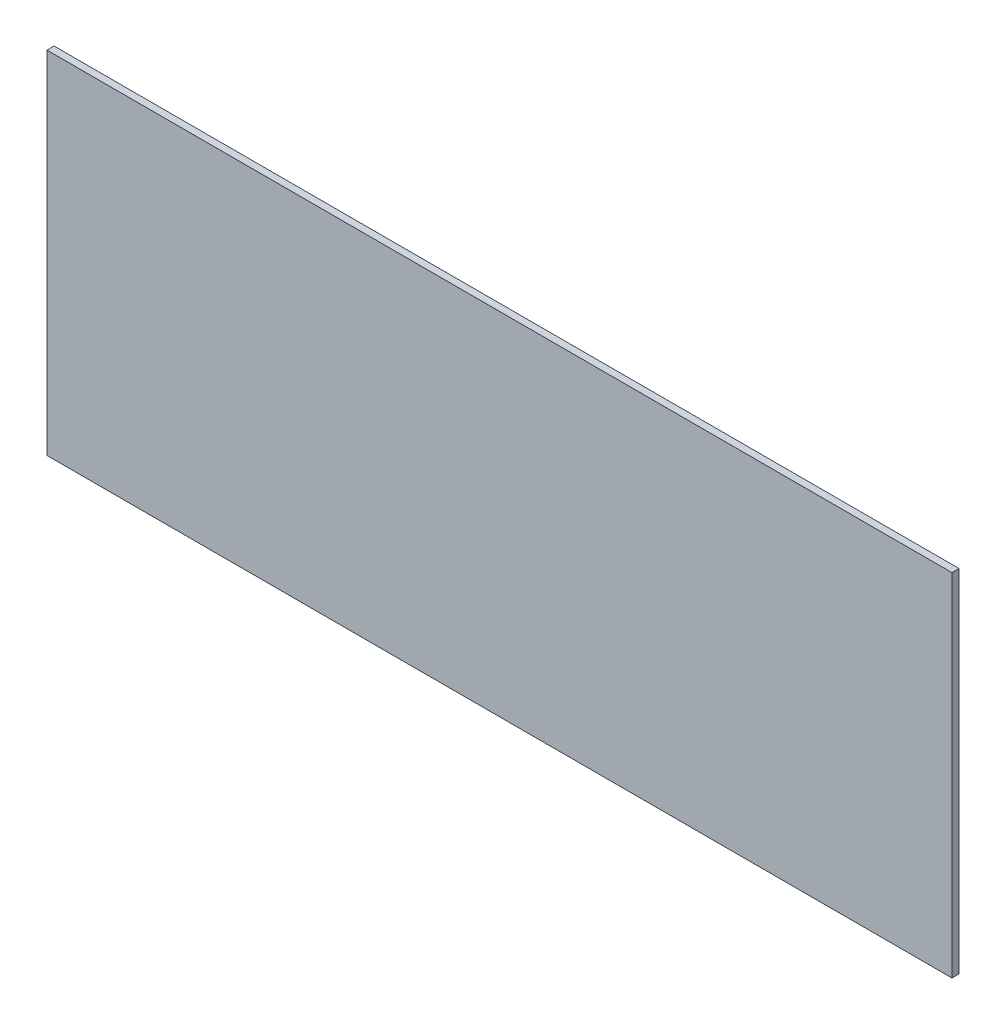
ISO-10303-21;
HEADER;
FILE_DESCRIPTION(('STEP AP214'),'2;1');
FILE_NAME('part.step','',(''),(''),'','','');
FILE_SCHEMA(('AUTOMOTIVE_DESIGN { 1 0 10303 214 1 1 1 1 }'));
ENDSEC;
DATA;
#1=APPLICATION_CONTEXT('core data for automotive mechanical design processes');
#2=APPLICATION_PROTOCOL_DEFINITION('international standard','automotive_design',2000,#1);
#3=PRODUCT_CONTEXT('',#1,'mechanical');
#4=PRODUCT('Part','Part','',(#3));
#5=PRODUCT_RELATED_PRODUCT_CATEGORY('part','',(#4));
#6=PRODUCT_DEFINITION_FORMATION('','',#4);
#7=PRODUCT_DEFINITION_CONTEXT('part definition',#1,'design');
#8=PRODUCT_DEFINITION('design','',#6,#7);
#9=PRODUCT_DEFINITION_SHAPE('','',#8);
#10=(LENGTH_UNIT() NAMED_UNIT(*) SI_UNIT(.MILLI.,.METRE.));
#11=(NAMED_UNIT(*) PLANE_ANGLE_UNIT() SI_UNIT($,.RADIAN.));
#12=(NAMED_UNIT(*) SI_UNIT($,.STERADIAN.) SOLID_ANGLE_UNIT());
#13=UNCERTAINTY_MEASURE_WITH_UNIT(LENGTH_MEASURE(1.E-05),#10,'distance_accuracy_value','');
#14=(GEOMETRIC_REPRESENTATION_CONTEXT(3) GLOBAL_UNCERTAINTY_ASSIGNED_CONTEXT((#13)) GLOBAL_UNIT_ASSIGNED_CONTEXT((#10,
#11,#12)) REPRESENTATION_CONTEXT('',''));
#15=CARTESIAN_POINT('',(0.,0.,0.));
#16=DIRECTION('',(0.,0.,1.));
#17=DIRECTION('',(1.,0.,0.));
#18=AXIS2_PLACEMENT_3D('',#15,#16,#17);
#19=CARTESIAN_POINT('',(0.,0.,1.635));
#20=DIRECTION('',(0.,0.,1.));
#21=DIRECTION('',(1.,0.,0.));
#22=AXIS2_PLACEMENT_3D('',#19,#20,#21);
#23=PLANE('',#22);
#24=DIRECTION('',(0.,-1.,0.));
#25=VECTOR('',#24,1.);
#26=CARTESIAN_POINT('',(2.23,7.625,1.635));
#27=LINE('',#26,#25);
#28=CARTESIAN_POINT('',(2.23,7.625,1.635));
#29=VERTEX_POINT('',#28);
#30=CARTESIAN_POINT('',(2.23,5.895,1.635));
#31=VERTEX_POINT('',#30);
#32=EDGE_CURVE('E25',#29,#31,#27,.T.);
#33=ORIENTED_EDGE('',*,*,#32,.F.);
#34=DIRECTION('',(1.,0.,0.));
#35=VECTOR('',#34,1.);
#36=CARTESIAN_POINT('',(-2.23,7.625,1.635));
#37=LINE('',#36,#35);
#38=CARTESIAN_POINT('',(-2.23,7.625,1.635));
#39=VERTEX_POINT('',#38);
#40=EDGE_CURVE('E97',#39,#29,#37,.T.);
#41=ORIENTED_EDGE('',*,*,#40,.F.);
#42=DIRECTION('',(0.,1.,0.));
#43=VECTOR('',#42,1.);
#44=CARTESIAN_POINT('',(-2.23,5.895,1.635));
#45=LINE('',#44,#43);
#46=CARTESIAN_POINT('',(-2.23,5.895,1.635));
#47=VERTEX_POINT('',#46);
#48=EDGE_CURVE('E83',#47,#39,#45,.T.);
#49=ORIENTED_EDGE('',*,*,#48,.F.);
#50=DIRECTION('',(-1.,0.,0.));
#51=VECTOR('',#50,1.);
#52=CARTESIAN_POINT('',(2.23,5.895,1.635));
#53=LINE('',#52,#51);
#54=EDGE_CURVE('E87',#31,#47,#53,.T.);
#55=ORIENTED_EDGE('',*,*,#54,.F.);
#56=EDGE_LOOP('',(#33,#41,#49,#55));
#57=FACE_BOUND('',#56,.T.);
#58=ADVANCED_FACE('F17',(#57),#23,.T.);
#59=CARTESIAN_POINT('',(0.,0.,1.6));
#60=DIRECTION('',(0.,0.,1.));
#61=DIRECTION('',(1.,0.,0.));
#62=AXIS2_PLACEMENT_3D('',#59,#60,#61);
#63=PLANE('',#62);
#64=DIRECTION('',(-1.,0.,0.));
#65=VECTOR('',#64,1.);
#66=CARTESIAN_POINT('',(2.23,5.895,1.6));
#67=LINE('',#66,#65);
#68=CARTESIAN_POINT('',(2.23,5.895,1.6));
#69=VERTEX_POINT('',#68);
#70=CARTESIAN_POINT('',(-2.23,5.895,1.6));
#71=VERTEX_POINT('',#70);
#72=EDGE_CURVE('E71',#69,#71,#67,.T.);
#73=ORIENTED_EDGE('',*,*,#72,.T.);
#74=DIRECTION('',(0.,1.,0.));
#75=VECTOR('',#74,1.);
#76=CARTESIAN_POINT('',(-2.23,5.895,1.6));
#77=LINE('',#76,#75);
#78=CARTESIAN_POINT('',(-2.23,7.625,1.6));
#79=VERTEX_POINT('',#78);
#80=EDGE_CURVE('E103',#71,#79,#77,.T.);
#81=ORIENTED_EDGE('',*,*,#80,.T.);
#82=DIRECTION('',(1.,0.,0.));
#83=VECTOR('',#82,1.);
#84=CARTESIAN_POINT('',(-2.23,7.625,1.6));
#85=LINE('',#84,#83);
#86=CARTESIAN_POINT('',(2.23,7.625,1.6));
#87=VERTEX_POINT('',#86);
#88=EDGE_CURVE('E73',#79,#87,#85,.T.);
#89=ORIENTED_EDGE('',*,*,#88,.T.);
#90=DIRECTION('',(0.,-1.,0.));
#91=VECTOR('',#90,1.);
#92=CARTESIAN_POINT('',(2.23,7.625,1.6));
#93=LINE('',#92,#91);
#94=EDGE_CURVE('E11',#87,#69,#93,.T.);
#95=ORIENTED_EDGE('',*,*,#94,.T.);
#96=EDGE_LOOP('',(#73,#81,#89,#95));
#97=FACE_BOUND('',#96,.T.);
#98=ADVANCED_FACE('F69',(#97),#63,.F.);
#99=CARTESIAN_POINT('',(2.23,7.625,1.6));
#100=DIRECTION('',(1.,0.,0.));
#101=DIRECTION('',(0.,1.,0.));
#102=AXIS2_PLACEMENT_3D('',#99,#100,#101);
#103=PLANE('',#102);
#104=DIRECTION('',(0.,0.,1.));
#105=VECTOR('',#104,1.);
#106=CARTESIAN_POINT('',(2.23,7.625,1.6));
#107=LINE('',#106,#105);
#108=EDGE_CURVE('E95',#87,#29,#107,.T.);
#109=ORIENTED_EDGE('',*,*,#108,.T.);
#110=ORIENTED_EDGE('',*,*,#32,.T.);
#111=DIRECTION('',(0.,0.,1.));
#112=VECTOR('',#111,1.);
#113=CARTESIAN_POINT('',(2.23,5.895,1.6));
#114=LINE('',#113,#112);
#115=EDGE_CURVE('E79',#69,#31,#114,.T.);
#116=ORIENTED_EDGE('',*,*,#115,.F.);
#117=ORIENTED_EDGE('',*,*,#94,.F.);
#118=EDGE_LOOP('',(#109,#110,#116,#117));
#119=FACE_BOUND('',#118,.T.);
#120=ADVANCED_FACE('F85',(#119),#103,.T.);
#121=CARTESIAN_POINT('',(-2.23,7.625,1.6));
#122=DIRECTION('',(0.,1.,0.));
#123=DIRECTION('',(1.,0.,0.));
#124=AXIS2_PLACEMENT_3D('',#121,#122,#123);
#125=PLANE('',#124);
#126=DIRECTION('',(0.,0.,1.));
#127=VECTOR('',#126,1.);
#128=CARTESIAN_POINT('',(-2.23,7.625,1.6));
#129=LINE('',#128,#127);
#130=EDGE_CURVE('E99',#79,#39,#129,.T.);
#131=ORIENTED_EDGE('',*,*,#130,.T.);
#132=ORIENTED_EDGE('',*,*,#40,.T.);
#133=ORIENTED_EDGE('',*,*,#108,.F.);
#134=ORIENTED_EDGE('',*,*,#88,.F.);
#135=EDGE_LOOP('',(#131,#132,#133,#134));
#136=FACE_BOUND('',#135,.T.);
#137=ADVANCED_FACE('F171',(#136),#125,.T.);
#138=CARTESIAN_POINT('',(-2.23,5.895,1.6));
#139=DIRECTION('',(-1.,0.,0.));
#140=DIRECTION('',(0.,0.,1.));
#141=AXIS2_PLACEMENT_3D('',#138,#139,#140);
#142=PLANE('',#141);
#143=DIRECTION('',(0.,0.,1.));
#144=VECTOR('',#143,1.);
#145=CARTESIAN_POINT('',(-2.23,5.895,1.6));
#146=LINE('',#145,#144);
#147=EDGE_CURVE('E81',#71,#47,#146,.T.);
#148=ORIENTED_EDGE('',*,*,#147,.T.);
#149=ORIENTED_EDGE('',*,*,#48,.T.);
#150=ORIENTED_EDGE('',*,*,#130,.F.);
#151=ORIENTED_EDGE('',*,*,#80,.F.);
#152=EDGE_LOOP('',(#148,#149,#150,#151));
#153=FACE_BOUND('',#152,.T.);
#154=ADVANCED_FACE('F159',(#153),#142,.T.);
#155=CARTESIAN_POINT('',(2.23,5.895,1.6));
#156=DIRECTION('',(0.,-1.,0.));
#157=DIRECTION('',(0.,0.,-1.));
#158=AXIS2_PLACEMENT_3D('',#155,#156,#157);
#159=PLANE('',#158);
#160=ORIENTED_EDGE('',*,*,#115,.T.);
#161=ORIENTED_EDGE('',*,*,#54,.T.);
#162=ORIENTED_EDGE('',*,*,#147,.F.);
#163=ORIENTED_EDGE('',*,*,#72,.F.);
#164=EDGE_LOOP('',(#160,#161,#162,#163));
#165=FACE_BOUND('',#164,.T.);
#166=ADVANCED_FACE('F77',(#165),#159,.T.);
#167=CLOSED_SHELL('',(#58,#98,#120,#137,#154,#166));
#168=MANIFOLD_SOLID_BREP('B1',#167);
#169=ADVANCED_BREP_SHAPE_REPRESENTATION('',(#18,#168),#14);
#170=SHAPE_DEFINITION_REPRESENTATION(#9,#169);
ENDSEC;
END-ISO-10303-21;
